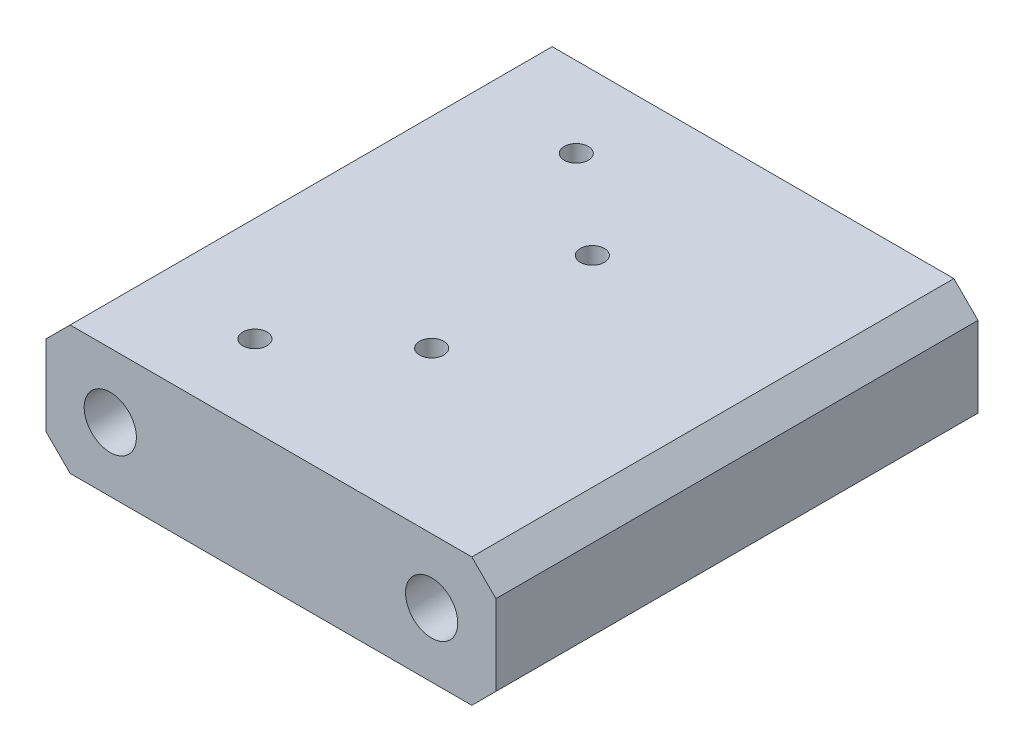
ISO-10303-21;
HEADER;
FILE_DESCRIPTION(('STEP AP214'),'2;1');
FILE_NAME('part.step','',(''),(''),'','','');
FILE_SCHEMA(('AUTOMOTIVE_DESIGN { 1 0 10303 214 1 1 1 1 }'));
ENDSEC;
DATA;
#1=APPLICATION_CONTEXT('core data for automotive mechanical design processes');
#2=APPLICATION_PROTOCOL_DEFINITION('international standard','automotive_design',2000,#1);
#3=PRODUCT_CONTEXT('',#1,'mechanical');
#4=PRODUCT('Part','Part','',(#3));
#5=PRODUCT_RELATED_PRODUCT_CATEGORY('part','',(#4));
#6=PRODUCT_DEFINITION_FORMATION('','',#4);
#7=PRODUCT_DEFINITION_CONTEXT('part definition',#1,'design');
#8=PRODUCT_DEFINITION('design','',#6,#7);
#9=PRODUCT_DEFINITION_SHAPE('','',#8);
#10=(LENGTH_UNIT() NAMED_UNIT(*) SI_UNIT(.MILLI.,.METRE.));
#11=(NAMED_UNIT(*) PLANE_ANGLE_UNIT() SI_UNIT($,.RADIAN.));
#12=(NAMED_UNIT(*) SI_UNIT($,.STERADIAN.) SOLID_ANGLE_UNIT());
#13=UNCERTAINTY_MEASURE_WITH_UNIT(LENGTH_MEASURE(1.E-05),#10,'distance_accuracy_value','');
#14=(GEOMETRIC_REPRESENTATION_CONTEXT(3) GLOBAL_UNCERTAINTY_ASSIGNED_CONTEXT((#13)) GLOBAL_UNIT_ASSIGNED_CONTEXT((#10,
#11,#12)) REPRESENTATION_CONTEXT('',''));
#15=CARTESIAN_POINT('',(0.,0.,0.));
#16=DIRECTION('',(0.,0.,1.));
#17=DIRECTION('',(1.,0.,0.));
#18=AXIS2_PLACEMENT_3D('',#15,#16,#17);
#19=CARTESIAN_POINT('',(0.,16.,0.));
#20=DIRECTION('',(0.,0.,-1.));
#21=DIRECTION('',(-1.,0.,0.));
#22=AXIS2_PLACEMENT_3D('',#19,#20,#21);
#23=PLANE('',#22);
#24=CARTESIAN_POINT('',(5.,8.,0.));
#25=DIRECTION('',(0.,0.,-1.));
#26=DIRECTION('',(-1.,0.,0.));
#27=AXIS2_PLACEMENT_3D('',#24,#25,#26);
#28=CIRCLE('',#27,3.25);
#29=CARTESIAN_POINT('',(1.75,8.,0.));
#30=VERTEX_POINT('',#29);
#31=EDGE_CURVE('E161',#30,#30,#28,.T.);
#32=ORIENTED_EDGE('',*,*,#31,.T.);
#33=EDGE_LOOP('',(#32));
#34=FACE_BOUND('',#33,.T.);
#35=CARTESIAN_POINT('',(45.,8.,0.));
#36=DIRECTION('',(0.,0.,-1.));
#37=DIRECTION('',(-1.,0.,0.));
#38=AXIS2_PLACEMENT_3D('',#35,#36,#37);
#39=CIRCLE('',#38,3.25);
#40=CARTESIAN_POINT('',(41.75,8.,0.));
#41=VERTEX_POINT('',#40);
#42=EDGE_CURVE('E167',#41,#41,#39,.T.);
#43=ORIENTED_EDGE('',*,*,#42,.T.);
#44=EDGE_LOOP('',(#43));
#45=FACE_BOUND('',#44,.T.);
#46=DIRECTION('',(1.,0.,0.));
#47=VECTOR('',#46,1.);
#48=CARTESIAN_POINT('',(0.,0.,0.));
#49=LINE('',#48,#47);
#50=CARTESIAN_POINT('',(0.,0.,0.));
#51=VERTEX_POINT('',#50);
#52=CARTESIAN_POINT('',(50.,0.,0.));
#53=VERTEX_POINT('',#52);
#54=EDGE_CURVE('E170',#51,#53,#49,.T.);
#55=ORIENTED_EDGE('',*,*,#54,.T.);
#56=DIRECTION('',(0.707106781186548,0.707106781186547,0.));
#57=VECTOR('',#56,1.);
#58=CARTESIAN_POINT('',(50.,0.,0.));
#59=LINE('',#58,#57);
#60=CARTESIAN_POINT('',(53.,3.,0.));
#61=VERTEX_POINT('',#60);
#62=EDGE_CURVE('E115',#53,#61,#59,.T.);
#63=ORIENTED_EDGE('',*,*,#62,.T.);
#64=DIRECTION('',(0.,1.,0.));
#65=VECTOR('',#64,1.);
#66=CARTESIAN_POINT('',(53.,3.,0.));
#67=LINE('',#66,#65);
#68=CARTESIAN_POINT('',(53.,13.,0.));
#69=VERTEX_POINT('',#68);
#70=EDGE_CURVE('E119',#61,#69,#67,.T.);
#71=ORIENTED_EDGE('',*,*,#70,.T.);
#72=DIRECTION('',(-0.707106781186547,0.707106781186547,0.));
#73=VECTOR('',#72,1.);
#74=CARTESIAN_POINT('',(53.,13.,0.));
#75=LINE('',#74,#73);
#76=CARTESIAN_POINT('',(50.,16.,0.));
#77=VERTEX_POINT('',#76);
#78=EDGE_CURVE('E122',#69,#77,#75,.T.);
#79=ORIENTED_EDGE('',*,*,#78,.T.);
#80=DIRECTION('',(1.,0.,0.));
#81=VECTOR('',#80,1.);
#82=CARTESIAN_POINT('',(0.,16.,0.));
#83=LINE('',#82,#81);
#84=CARTESIAN_POINT('',(0.,16.,0.));
#85=VERTEX_POINT('',#84);
#86=EDGE_CURVE('E51',#85,#77,#83,.T.);
#87=ORIENTED_EDGE('',*,*,#86,.F.);
#88=DIRECTION('',(-0.707106781186547,-0.707106781186548,0.));
#89=VECTOR('',#88,1.);
#90=CARTESIAN_POINT('',(-3.,13.,0.));
#91=LINE('',#90,#89);
#92=CARTESIAN_POINT('',(-3.,13.,0.));
#93=VERTEX_POINT('',#92);
#94=EDGE_CURVE('E130',#85,#93,#91,.T.);
#95=ORIENTED_EDGE('',*,*,#94,.T.);
#96=DIRECTION('',(0.,-1.,0.));
#97=VECTOR('',#96,1.);
#98=CARTESIAN_POINT('',(-3.,3.,0.));
#99=LINE('',#98,#97);
#100=CARTESIAN_POINT('',(-3.,3.,0.));
#101=VERTEX_POINT('',#100);
#102=EDGE_CURVE('E142',#93,#101,#99,.T.);
#103=ORIENTED_EDGE('',*,*,#102,.T.);
#104=DIRECTION('',(0.707106781186547,-0.707106781186547,0.));
#105=VECTOR('',#104,1.);
#106=CARTESIAN_POINT('',(0.,0.,0.));
#107=LINE('',#106,#105);
#108=EDGE_CURVE('E134',#101,#51,#107,.T.);
#109=ORIENTED_EDGE('',*,*,#108,.T.);
#110=EDGE_LOOP('',(#55,#63,#71,#79,#87,#95,#103,#109));
#111=FACE_BOUND('',#110,.T.);
#112=ADVANCED_FACE('F33',(#34,#45,#111),#23,.F.);
#113=CARTESIAN_POINT('',(0.,16.,-60.));
#114=DIRECTION('',(0.,0.,-1.));
#115=DIRECTION('',(-1.,0.,0.));
#116=AXIS2_PLACEMENT_3D('',#113,#114,#115);
#117=PLANE('',#116);
#118=CARTESIAN_POINT('',(5.,8.,-60.));
#119=DIRECTION('',(0.,0.,-1.));
#120=DIRECTION('',(-1.,0.,0.));
#121=AXIS2_PLACEMENT_3D('',#118,#119,#120);
#122=CIRCLE('',#121,3.25);
#123=CARTESIAN_POINT('',(1.75,8.,-60.));
#124=VERTEX_POINT('',#123);
#125=EDGE_CURVE('E158',#124,#124,#122,.T.);
#126=ORIENTED_EDGE('',*,*,#125,.F.);
#127=EDGE_LOOP('',(#126));
#128=FACE_BOUND('',#127,.T.);
#129=CARTESIAN_POINT('',(45.,8.,-60.));
#130=DIRECTION('',(0.,0.,-1.));
#131=DIRECTION('',(-1.,0.,0.));
#132=AXIS2_PLACEMENT_3D('',#129,#130,#131);
#133=CIRCLE('',#132,3.25);
#134=CARTESIAN_POINT('',(41.75,8.,-60.));
#135=VERTEX_POINT('',#134);
#136=EDGE_CURVE('E164',#135,#135,#133,.T.);
#137=ORIENTED_EDGE('',*,*,#136,.F.);
#138=EDGE_LOOP('',(#137));
#139=FACE_BOUND('',#138,.T.);
#140=DIRECTION('',(1.,0.,0.));
#141=VECTOR('',#140,1.);
#142=CARTESIAN_POINT('',(0.,0.,-60.));
#143=LINE('',#142,#141);
#144=CARTESIAN_POINT('',(0.,0.,-60.));
#145=VERTEX_POINT('',#144);
#146=CARTESIAN_POINT('',(50.,0.,-60.));
#147=VERTEX_POINT('',#146);
#148=EDGE_CURVE('E64',#145,#147,#143,.T.);
#149=ORIENTED_EDGE('',*,*,#148,.F.);
#150=DIRECTION('',(0.707106781186547,-0.707106781186547,0.));
#151=VECTOR('',#150,1.);
#152=CARTESIAN_POINT('',(0.,0.,-60.));
#153=LINE('',#152,#151);
#154=CARTESIAN_POINT('',(-3.,3.,-60.));
#155=VERTEX_POINT('',#154);
#156=EDGE_CURVE('E137',#155,#145,#153,.T.);
#157=ORIENTED_EDGE('',*,*,#156,.F.);
#158=DIRECTION('',(0.,-1.,0.));
#159=VECTOR('',#158,1.);
#160=CARTESIAN_POINT('',(-3.,3.,-60.));
#161=LINE('',#160,#159);
#162=CARTESIAN_POINT('',(-3.,13.,-60.));
#163=VERTEX_POINT('',#162);
#164=EDGE_CURVE('E133',#163,#155,#161,.T.);
#165=ORIENTED_EDGE('',*,*,#164,.F.);
#166=DIRECTION('',(-0.707106781186547,-0.707106781186548,0.));
#167=VECTOR('',#166,1.);
#168=CARTESIAN_POINT('',(-3.,13.,-60.));
#169=LINE('',#168,#167);
#170=CARTESIAN_POINT('',(0.,16.,-60.));
#171=VERTEX_POINT('',#170);
#172=EDGE_CURVE('E104',#171,#163,#169,.T.);
#173=ORIENTED_EDGE('',*,*,#172,.F.);
#174=DIRECTION('',(1.,0.,0.));
#175=VECTOR('',#174,1.);
#176=CARTESIAN_POINT('',(0.,16.,-60.));
#177=LINE('',#176,#175);
#178=CARTESIAN_POINT('',(50.,16.,-60.));
#179=VERTEX_POINT('',#178);
#180=EDGE_CURVE('E42',#171,#179,#177,.T.);
#181=ORIENTED_EDGE('',*,*,#180,.T.);
#182=DIRECTION('',(-0.707106781186547,0.707106781186547,0.));
#183=VECTOR('',#182,1.);
#184=CARTESIAN_POINT('',(53.,13.,-60.));
#185=LINE('',#184,#183);
#186=CARTESIAN_POINT('',(53.,13.,-60.));
#187=VERTEX_POINT('',#186);
#188=EDGE_CURVE('E100',#187,#179,#185,.T.);
#189=ORIENTED_EDGE('',*,*,#188,.F.);
#190=DIRECTION('',(0.,1.,0.));
#191=VECTOR('',#190,1.);
#192=CARTESIAN_POINT('',(53.,3.,-60.));
#193=LINE('',#192,#191);
#194=CARTESIAN_POINT('',(53.,3.,-60.));
#195=VERTEX_POINT('',#194);
#196=EDGE_CURVE('E111',#195,#187,#193,.T.);
#197=ORIENTED_EDGE('',*,*,#196,.F.);
#198=DIRECTION('',(0.707106781186548,0.707106781186547,0.));
#199=VECTOR('',#198,1.);
#200=CARTESIAN_POINT('',(50.,0.,-60.));
#201=LINE('',#200,#199);
#202=EDGE_CURVE('E110',#147,#195,#201,.T.);
#203=ORIENTED_EDGE('',*,*,#202,.F.);
#204=EDGE_LOOP('',(#149,#157,#165,#173,#181,#189,#197,#203));
#205=FACE_BOUND('',#204,.T.);
#206=ADVANCED_FACE('F97',(#128,#139,#205),#117,.T.);
#207=CARTESIAN_POINT('',(0.,16.,0.));
#208=DIRECTION('',(0.,1.,0.));
#209=DIRECTION('',(0.,0.,1.));
#210=AXIS2_PLACEMENT_3D('',#207,#208,#209);
#211=PLANE('',#210);
#212=CARTESIAN_POINT('',(25.,16.,-40.));
#213=DIRECTION('',(0.,1.,0.));
#214=DIRECTION('',(0.,0.,1.));
#215=AXIS2_PLACEMENT_3D('',#212,#213,#214);
#216=CIRCLE('',#215,1.5);
#217=CARTESIAN_POINT('',(25.,16.,-38.5));
#218=VERTEX_POINT('',#217);
#219=EDGE_CURVE('E189',#218,#218,#216,.T.);
#220=ORIENTED_EDGE('',*,*,#219,.F.);
#221=EDGE_LOOP('',(#220));
#222=FACE_BOUND('',#221,.T.);
#223=CARTESIAN_POINT('',(25.,16.,-20.));
#224=DIRECTION('',(0.,1.,0.));
#225=DIRECTION('',(0.,0.,1.));
#226=AXIS2_PLACEMENT_3D('',#223,#224,#225);
#227=CIRCLE('',#226,1.5);
#228=CARTESIAN_POINT('',(25.,16.,-18.5));
#229=VERTEX_POINT('',#228);
#230=EDGE_CURVE('E182',#229,#229,#227,.T.);
#231=ORIENTED_EDGE('',*,*,#230,.F.);
#232=EDGE_LOOP('',(#231));
#233=FACE_BOUND('',#232,.T.);
#234=CARTESIAN_POINT('',(13.,16.,-50.));
#235=DIRECTION('',(0.,1.,0.));
#236=DIRECTION('',(0.,0.,1.));
#237=AXIS2_PLACEMENT_3D('',#234,#235,#236);
#238=CIRCLE('',#237,1.5);
#239=CARTESIAN_POINT('',(13.,16.,-48.5));
#240=VERTEX_POINT('',#239);
#241=EDGE_CURVE('E149',#240,#240,#238,.T.);
#242=ORIENTED_EDGE('',*,*,#241,.F.);
#243=EDGE_LOOP('',(#242));
#244=FACE_BOUND('',#243,.T.);
#245=CARTESIAN_POINT('',(13.,16.,-10.));
#246=DIRECTION('',(0.,1.,0.));
#247=DIRECTION('',(0.,0.,1.));
#248=AXIS2_PLACEMENT_3D('',#245,#246,#247);
#249=CIRCLE('',#248,1.5);
#250=CARTESIAN_POINT('',(13.,16.,-8.5));
#251=VERTEX_POINT('',#250);
#252=EDGE_CURVE('E154',#251,#251,#249,.T.);
#253=ORIENTED_EDGE('',*,*,#252,.F.);
#254=EDGE_LOOP('',(#253));
#255=FACE_BOUND('',#254,.T.);
#256=ORIENTED_EDGE('',*,*,#86,.T.);
#257=DIRECTION('',(0.,0.,-1.));
#258=VECTOR('',#257,1.);
#259=CARTESIAN_POINT('',(50.,16.,0.));
#260=LINE('',#259,#258);
#261=EDGE_CURVE('E87',#77,#179,#260,.T.);
#262=ORIENTED_EDGE('',*,*,#261,.T.);
#263=ORIENTED_EDGE('',*,*,#180,.F.);
#264=DIRECTION('',(0.,0.,-1.));
#265=VECTOR('',#264,1.);
#266=CARTESIAN_POINT('',(0.,16.,0.));
#267=LINE('',#266,#265);
#268=EDGE_CURVE('E11',#85,#171,#267,.T.);
#269=ORIENTED_EDGE('',*,*,#268,.F.);
#270=EDGE_LOOP('',(#256,#262,#263,#269));
#271=FACE_BOUND('',#270,.T.);
#272=ADVANCED_FACE('F89',(#222,#233,#244,#255,#271),#211,.T.);
#273=CARTESIAN_POINT('',(0.,0.,0.));
#274=DIRECTION('',(0.,1.,0.));
#275=DIRECTION('',(0.,0.,1.));
#276=AXIS2_PLACEMENT_3D('',#273,#274,#275);
#277=PLANE('',#276);
#278=CARTESIAN_POINT('',(25.,0.,-40.));
#279=DIRECTION('',(0.,1.,0.));
#280=DIRECTION('',(0.,0.,1.));
#281=AXIS2_PLACEMENT_3D('',#278,#279,#280);
#282=CIRCLE('',#281,1.5);
#283=CARTESIAN_POINT('',(25.,0.,-38.5));
#284=VERTEX_POINT('',#283);
#285=EDGE_CURVE('E36',#284,#284,#282,.T.);
#286=ORIENTED_EDGE('',*,*,#285,.T.);
#287=EDGE_LOOP('',(#286));
#288=FACE_BOUND('',#287,.T.);
#289=CARTESIAN_POINT('',(25.,0.,-20.));
#290=DIRECTION('',(0.,1.,0.));
#291=DIRECTION('',(0.,0.,1.));
#292=AXIS2_PLACEMENT_3D('',#289,#290,#291);
#293=CIRCLE('',#292,1.5);
#294=CARTESIAN_POINT('',(25.,0.,-18.5));
#295=VERTEX_POINT('',#294);
#296=EDGE_CURVE('E123',#295,#295,#293,.T.);
#297=ORIENTED_EDGE('',*,*,#296,.T.);
#298=EDGE_LOOP('',(#297));
#299=FACE_BOUND('',#298,.T.);
#300=CARTESIAN_POINT('',(13.,0.,-50.));
#301=DIRECTION('',(0.,1.,0.));
#302=DIRECTION('',(0.,0.,1.));
#303=AXIS2_PLACEMENT_3D('',#300,#301,#302);
#304=CIRCLE('',#303,1.5);
#305=CARTESIAN_POINT('',(13.,0.,-48.5));
#306=VERTEX_POINT('',#305);
#307=EDGE_CURVE('E153',#306,#306,#304,.T.);
#308=ORIENTED_EDGE('',*,*,#307,.T.);
#309=EDGE_LOOP('',(#308));
#310=FACE_BOUND('',#309,.T.);
#311=CARTESIAN_POINT('',(13.,0.,-10.));
#312=DIRECTION('',(0.,1.,0.));
#313=DIRECTION('',(0.,0.,1.));
#314=AXIS2_PLACEMENT_3D('',#311,#312,#313);
#315=CIRCLE('',#314,1.5);
#316=CARTESIAN_POINT('',(13.,0.,-8.5));
#317=VERTEX_POINT('',#316);
#318=EDGE_CURVE('E157',#317,#317,#315,.T.);
#319=ORIENTED_EDGE('',*,*,#318,.T.);
#320=EDGE_LOOP('',(#319));
#321=FACE_BOUND('',#320,.T.);
#322=ORIENTED_EDGE('',*,*,#54,.F.);
#323=DIRECTION('',(0.,0.,-1.));
#324=VECTOR('',#323,1.);
#325=CARTESIAN_POINT('',(0.,0.,0.));
#326=LINE('',#325,#324);
#327=EDGE_CURVE('E71',#51,#145,#326,.T.);
#328=ORIENTED_EDGE('',*,*,#327,.T.);
#329=ORIENTED_EDGE('',*,*,#148,.T.);
#330=DIRECTION('',(0.,0.,-1.));
#331=VECTOR('',#330,1.);
#332=CARTESIAN_POINT('',(50.,0.,0.));
#333=LINE('',#332,#331);
#334=EDGE_CURVE('E174',#53,#147,#333,.T.);
#335=ORIENTED_EDGE('',*,*,#334,.F.);
#336=EDGE_LOOP('',(#322,#328,#329,#335));
#337=FACE_BOUND('',#336,.T.);
#338=ADVANCED_FACE('F199',(#288,#299,#310,#321,#337),#277,.F.);
#339=CARTESIAN_POINT('',(45.,8.,40.));
#340=DIRECTION('',(0.,0.,-1.));
#341=DIRECTION('',(-1.,0.,0.));
#342=AXIS2_PLACEMENT_3D('',#339,#340,#341);
#343=CYLINDRICAL_SURFACE('',#342,3.25);
#344=ORIENTED_EDGE('',*,*,#136,.T.);
#345=EDGE_LOOP('',(#344));
#346=FACE_BOUND('',#345,.T.);
#347=ORIENTED_EDGE('',*,*,#42,.F.);
#348=EDGE_LOOP('',(#347));
#349=FACE_BOUND('',#348,.T.);
#350=ADVANCED_FACE('F215',(#346,#349),#343,.F.);
#351=CARTESIAN_POINT('',(5.,8.,40.));
#352=DIRECTION('',(0.,0.,-1.));
#353=DIRECTION('',(-1.,0.,0.));
#354=AXIS2_PLACEMENT_3D('',#351,#352,#353);
#355=CYLINDRICAL_SURFACE('',#354,3.25);
#356=ORIENTED_EDGE('',*,*,#125,.T.);
#357=EDGE_LOOP('',(#356));
#358=FACE_BOUND('',#357,.T.);
#359=ORIENTED_EDGE('',*,*,#31,.F.);
#360=EDGE_LOOP('',(#359));
#361=FACE_BOUND('',#360,.T.);
#362=ADVANCED_FACE('F210',(#358,#361),#355,.F.);
#363=CARTESIAN_POINT('',(13.,-84.,-10.));
#364=DIRECTION('',(0.,1.,0.));
#365=DIRECTION('',(0.,0.,1.));
#366=AXIS2_PLACEMENT_3D('',#363,#364,#365);
#367=CYLINDRICAL_SURFACE('',#366,1.5);
#368=ORIENTED_EDGE('',*,*,#252,.T.);
#369=EDGE_LOOP('',(#368));
#370=FACE_BOUND('',#369,.T.);
#371=ORIENTED_EDGE('',*,*,#318,.F.);
#372=EDGE_LOOP('',(#371));
#373=FACE_BOUND('',#372,.T.);
#374=ADVANCED_FACE('F206',(#370,#373),#367,.F.);
#375=CARTESIAN_POINT('',(13.,-84.,-50.));
#376=DIRECTION('',(0.,1.,0.));
#377=DIRECTION('',(0.,0.,1.));
#378=AXIS2_PLACEMENT_3D('',#375,#376,#377);
#379=CYLINDRICAL_SURFACE('',#378,1.5);
#380=ORIENTED_EDGE('',*,*,#241,.T.);
#381=EDGE_LOOP('',(#380));
#382=FACE_BOUND('',#381,.T.);
#383=ORIENTED_EDGE('',*,*,#307,.F.);
#384=EDGE_LOOP('',(#383));
#385=FACE_BOUND('',#384,.T.);
#386=ADVANCED_FACE('F209',(#382,#385),#379,.F.);
#387=CARTESIAN_POINT('',(0.,0.,-60.));
#388=DIRECTION('',(-0.707106781186547,-0.707106781186547,0.));
#389=DIRECTION('',(0.707106781186548,-0.707106781186548,0.));
#390=AXIS2_PLACEMENT_3D('',#387,#388,#389);
#391=PLANE('',#390);
#392=ORIENTED_EDGE('',*,*,#108,.F.);
#393=DIRECTION('',(0.,0.,1.));
#394=VECTOR('',#393,1.);
#395=CARTESIAN_POINT('',(-3.,3.,-60.));
#396=LINE('',#395,#394);
#397=EDGE_CURVE('E147',#155,#101,#396,.T.);
#398=ORIENTED_EDGE('',*,*,#397,.F.);
#399=ORIENTED_EDGE('',*,*,#156,.T.);
#400=ORIENTED_EDGE('',*,*,#327,.F.);
#401=EDGE_LOOP('',(#392,#398,#399,#400));
#402=FACE_BOUND('',#401,.T.);
#403=ADVANCED_FACE('F222',(#402),#391,.T.);
#404=CARTESIAN_POINT('',(-3.,3.,-60.));
#405=DIRECTION('',(-1.,0.,0.));
#406=DIRECTION('',(0.,-1.,0.));
#407=AXIS2_PLACEMENT_3D('',#404,#405,#406);
#408=PLANE('',#407);
#409=ORIENTED_EDGE('',*,*,#102,.F.);
#410=DIRECTION('',(0.,0.,1.));
#411=VECTOR('',#410,1.);
#412=CARTESIAN_POINT('',(-3.,13.,-60.));
#413=LINE('',#412,#411);
#414=EDGE_CURVE('E140',#163,#93,#413,.T.);
#415=ORIENTED_EDGE('',*,*,#414,.F.);
#416=ORIENTED_EDGE('',*,*,#164,.T.);
#417=ORIENTED_EDGE('',*,*,#397,.T.);
#418=EDGE_LOOP('',(#409,#415,#416,#417));
#419=FACE_BOUND('',#418,.T.);
#420=ADVANCED_FACE('F228',(#419),#408,.T.);
#421=CARTESIAN_POINT('',(-3.,13.,-60.));
#422=DIRECTION('',(-0.707106781186548,0.707106781186547,0.));
#423=DIRECTION('',(-0.707106781186547,-0.707106781186548,0.));
#424=AXIS2_PLACEMENT_3D('',#421,#422,#423);
#425=PLANE('',#424);
#426=ORIENTED_EDGE('',*,*,#94,.F.);
#427=ORIENTED_EDGE('',*,*,#268,.T.);
#428=ORIENTED_EDGE('',*,*,#172,.T.);
#429=ORIENTED_EDGE('',*,*,#414,.T.);
#430=EDGE_LOOP('',(#426,#427,#428,#429));
#431=FACE_BOUND('',#430,.T.);
#432=ADVANCED_FACE('F244',(#431),#425,.T.);
#433=CARTESIAN_POINT('',(53.,3.,-60.));
#434=DIRECTION('',(1.,0.,0.));
#435=DIRECTION('',(0.,0.,-1.));
#436=AXIS2_PLACEMENT_3D('',#433,#434,#435);
#437=PLANE('',#436);
#438=ORIENTED_EDGE('',*,*,#70,.F.);
#439=DIRECTION('',(0.,0.,1.));
#440=VECTOR('',#439,1.);
#441=CARTESIAN_POINT('',(53.,3.,-60.));
#442=LINE('',#441,#440);
#443=EDGE_CURVE('E127',#195,#61,#442,.T.);
#444=ORIENTED_EDGE('',*,*,#443,.F.);
#445=ORIENTED_EDGE('',*,*,#196,.T.);
#446=DIRECTION('',(0.,0.,1.));
#447=VECTOR('',#446,1.);
#448=CARTESIAN_POINT('',(53.,13.,-60.));
#449=LINE('',#448,#447);
#450=EDGE_CURVE('E109',#187,#69,#449,.T.);
#451=ORIENTED_EDGE('',*,*,#450,.T.);
#452=EDGE_LOOP('',(#438,#444,#445,#451));
#453=FACE_BOUND('',#452,.T.);
#454=ADVANCED_FACE('F242',(#453),#437,.T.);
#455=CARTESIAN_POINT('',(50.,0.,-60.));
#456=DIRECTION('',(0.707106781186547,-0.707106781186548,0.));
#457=DIRECTION('',(0.707106781186548,0.707106781186547,0.));
#458=AXIS2_PLACEMENT_3D('',#455,#456,#457);
#459=PLANE('',#458);
#460=ORIENTED_EDGE('',*,*,#62,.F.);
#461=ORIENTED_EDGE('',*,*,#334,.T.);
#462=ORIENTED_EDGE('',*,*,#202,.T.);
#463=ORIENTED_EDGE('',*,*,#443,.T.);
#464=EDGE_LOOP('',(#460,#461,#462,#463));
#465=FACE_BOUND('',#464,.T.);
#466=ADVANCED_FACE('F231',(#465),#459,.T.);
#467=CARTESIAN_POINT('',(53.,13.,-60.));
#468=DIRECTION('',(0.707106781186547,0.707106781186547,0.));
#469=DIRECTION('',(-0.707106781186548,0.707106781186548,0.));
#470=AXIS2_PLACEMENT_3D('',#467,#468,#469);
#471=PLANE('',#470);
#472=ORIENTED_EDGE('',*,*,#78,.F.);
#473=ORIENTED_EDGE('',*,*,#450,.F.);
#474=ORIENTED_EDGE('',*,*,#188,.T.);
#475=ORIENTED_EDGE('',*,*,#261,.F.);
#476=EDGE_LOOP('',(#472,#473,#474,#475));
#477=FACE_BOUND('',#476,.T.);
#478=ADVANCED_FACE('F107',(#477),#471,.T.);
#479=CARTESIAN_POINT('',(25.,-44.,-20.));
#480=DIRECTION('',(0.,1.,0.));
#481=DIRECTION('',(0.,0.,1.));
#482=AXIS2_PLACEMENT_3D('',#479,#480,#481);
#483=CYLINDRICAL_SURFACE('',#482,1.5);
#484=ORIENTED_EDGE('',*,*,#230,.T.);
#485=EDGE_LOOP('',(#484));
#486=FACE_BOUND('',#485,.T.);
#487=ORIENTED_EDGE('',*,*,#296,.F.);
#488=EDGE_LOOP('',(#487));
#489=FACE_BOUND('',#488,.T.);
#490=ADVANCED_FACE('F311',(#486,#489),#483,.F.);
#491=CARTESIAN_POINT('',(25.,-44.,-40.));
#492=DIRECTION('',(0.,1.,0.));
#493=DIRECTION('',(0.,0.,1.));
#494=AXIS2_PLACEMENT_3D('',#491,#492,#493);
#495=CYLINDRICAL_SURFACE('',#494,1.5);
#496=ORIENTED_EDGE('',*,*,#219,.T.);
#497=EDGE_LOOP('',(#496));
#498=FACE_BOUND('',#497,.T.);
#499=ORIENTED_EDGE('',*,*,#285,.F.);
#500=EDGE_LOOP('',(#499));
#501=FACE_BOUND('',#500,.T.);
#502=ADVANCED_FACE('F194',(#498,#501),#495,.F.);
#503=CLOSED_SHELL('',(#112,#206,#272,#338,#350,#362,#374,#386,#403,#420,#432,#454,#466,#478,
#490,#502));
#504=MANIFOLD_SOLID_BREP('B2',#503);
#505=ADVANCED_BREP_SHAPE_REPRESENTATION('',(#18,#504),#14);
#506=SHAPE_DEFINITION_REPRESENTATION(#9,#505);
ENDSEC;
END-ISO-10303-21;
